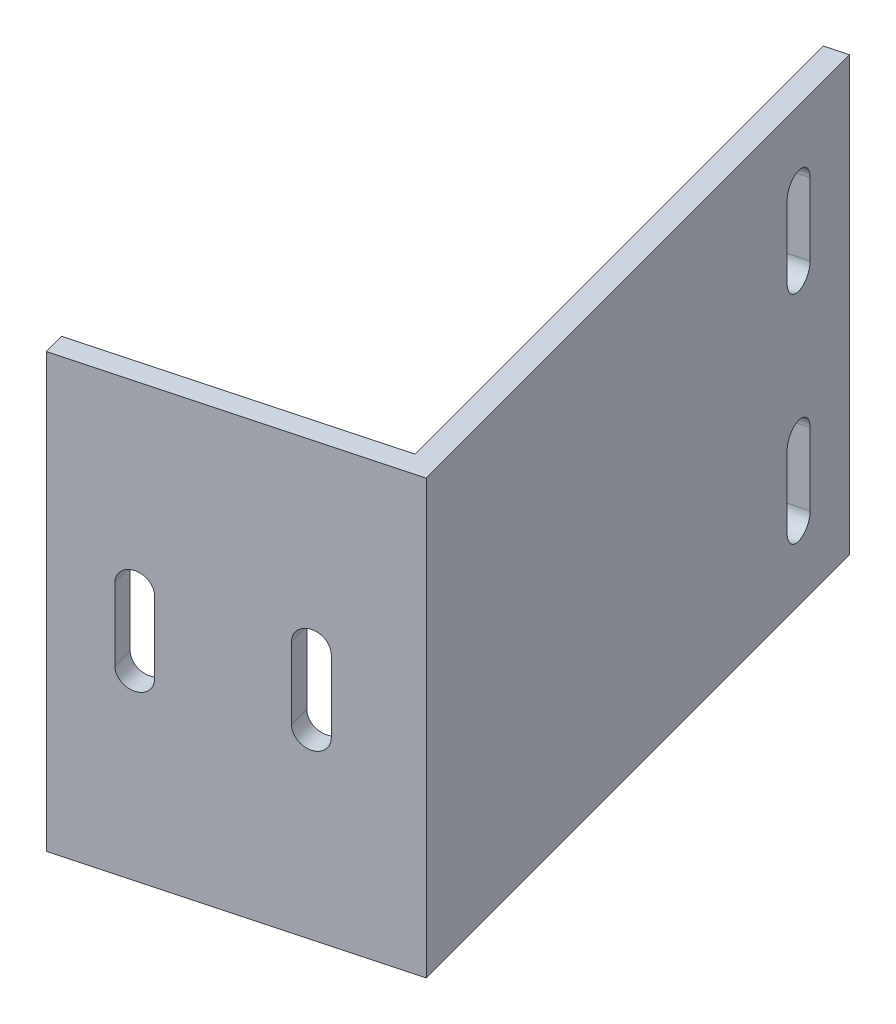
ISO-10303-21;
HEADER;
FILE_DESCRIPTION(('STEP AP214'),'2;1');
FILE_NAME('part.step','',(''),(''),'','','');
FILE_SCHEMA(('AUTOMOTIVE_DESIGN { 1 0 10303 214 1 1 1 1 }'));
ENDSEC;
DATA;
#1=APPLICATION_CONTEXT('core data for automotive mechanical design processes');
#2=APPLICATION_PROTOCOL_DEFINITION('international standard','automotive_design',2000,#1);
#3=PRODUCT_CONTEXT('',#1,'mechanical');
#4=PRODUCT('Part','Part','',(#3));
#5=PRODUCT_RELATED_PRODUCT_CATEGORY('part','',(#4));
#6=PRODUCT_DEFINITION_FORMATION('','',#4);
#7=PRODUCT_DEFINITION_CONTEXT('part definition',#1,'design');
#8=PRODUCT_DEFINITION('design','',#6,#7);
#9=PRODUCT_DEFINITION_SHAPE('','',#8);
#10=(LENGTH_UNIT() NAMED_UNIT(*) SI_UNIT(.MILLI.,.METRE.));
#11=(NAMED_UNIT(*) PLANE_ANGLE_UNIT() SI_UNIT($,.RADIAN.));
#12=(NAMED_UNIT(*) SI_UNIT($,.STERADIAN.) SOLID_ANGLE_UNIT());
#13=UNCERTAINTY_MEASURE_WITH_UNIT(LENGTH_MEASURE(1.E-05),#10,'distance_accuracy_value','');
#14=(GEOMETRIC_REPRESENTATION_CONTEXT(3) GLOBAL_UNCERTAINTY_ASSIGNED_CONTEXT((#13)) GLOBAL_UNIT_ASSIGNED_CONTEXT((#10,
#11,#12)) REPRESENTATION_CONTEXT('',''));
#15=CARTESIAN_POINT('',(0.,0.,0.));
#16=DIRECTION('',(0.,0.,1.));
#17=DIRECTION('',(1.,0.,0.));
#18=AXIS2_PLACEMENT_3D('',#15,#16,#17);
#19=CARTESIAN_POINT('',(903.80760213985,-1784.,2446.096201646));
#20=DIRECTION('',(-0.258819045102985,0.,-0.965925826288944));
#21=DIRECTION('',(-0.965925826288944,0.,0.258819045102985));
#22=AXIS2_PLACEMENT_3D('',#19,#20,#21);
#23=CYLINDRICAL_SURFACE('',#22,4.5);
#24=DIRECTION('',(0.258819045102985,0.,0.965925826288944));
#25=VECTOR('',#24,1.);
#26=CARTESIAN_POINT('',(908.15426835816,-1784.,2444.931515943));
#27=LINE('',#26,#25);
#28=CARTESIAN_POINT('',(908.18015026267,-1784.,2445.028108526));
#29=VERTEX_POINT('',#28);
#30=CARTESIAN_POINT('',(909.73306453328,-1784.,2450.823663484));
#31=VERTEX_POINT('',#30);
#32=EDGE_CURVE('E11',#29,#31,#27,.T.);
#33=ORIENTED_EDGE('',*,*,#32,.T.);
#34=CARTESIAN_POINT('',(905.38639831498,-1784.,2451.988349187));
#35=DIRECTION('',(-0.258819045102985,0.,-0.965925826288944));
#36=DIRECTION('',(-0.965925826288944,0.,0.258819045102985));
#37=AXIS2_PLACEMENT_3D('',#34,#35,#36);
#38=CIRCLE('',#37,4.5);
#39=CARTESIAN_POINT('',(901.03973209668,-1784.,2453.15303489));
#40=VERTEX_POINT('',#39);
#41=EDGE_CURVE('E351',#40,#31,#38,.T.);
#42=ORIENTED_EDGE('',*,*,#41,.F.);
#43=DIRECTION('',(0.258819045102985,0.,0.965925826288944));
#44=VECTOR('',#43,1.);
#45=CARTESIAN_POINT('',(899.46093592155,-1784.,2447.260887349));
#46=LINE('',#45,#44);
#47=CARTESIAN_POINT('',(899.48681782606,-1784.,2447.357479932));
#48=VERTEX_POINT('',#47);
#49=EDGE_CURVE('E406',#48,#40,#46,.T.);
#50=ORIENTED_EDGE('',*,*,#49,.F.);
#51=CARTESIAN_POINT('',(903.83348404436,-1784.,2446.192794229));
#52=DIRECTION('',(-0.258819045102985,0.,-0.965925826288944));
#53=DIRECTION('',(-0.965925826288944,0.,0.258819045102985));
#54=AXIS2_PLACEMENT_3D('',#51,#52,#53);
#55=CIRCLE('',#54,4.5);
#56=EDGE_CURVE('E339',#48,#29,#55,.T.);
#57=ORIENTED_EDGE('',*,*,#56,.T.);
#58=EDGE_LOOP('',(#33,#42,#50,#57));
#59=FACE_BOUND('',#58,.T.);
#60=ADVANCED_FACE('F17',(#59),#23,.F.);
#61=CARTESIAN_POINT('',(908.15426835816,-1784.,2444.931515943));
#62=DIRECTION('',(0.965925826288944,0.,-0.258819045102985));
#63=DIRECTION('',(0.,-1.,0.));
#64=AXIS2_PLACEMENT_3D('',#61,#62,#63);
#65=PLANE('',#64);
#66=DIRECTION('',(0.258819045102985,0.,0.965925826288944));
#67=VECTOR('',#66,1.);
#68=CARTESIAN_POINT('',(908.15426835816,-1804.,2444.931515943));
#69=LINE('',#68,#67);
#70=CARTESIAN_POINT('',(908.18015026267,-1804.,2445.028108526));
#71=VERTEX_POINT('',#70);
#72=CARTESIAN_POINT('',(909.73306453328,-1804.,2450.823663484));
#73=VERTEX_POINT('',#72);
#74=EDGE_CURVE('E25',#71,#73,#69,.T.);
#75=ORIENTED_EDGE('',*,*,#74,.T.);
#76=DIRECTION('',(0.,1.,0.));
#77=VECTOR('',#76,1.);
#78=CARTESIAN_POINT('',(909.73306453328,-1819.,2450.823663484));
#79=LINE('',#78,#77);
#80=EDGE_CURVE('E347',#73,#31,#79,.T.);
#81=ORIENTED_EDGE('',*,*,#80,.T.);
#82=ORIENTED_EDGE('',*,*,#32,.F.);
#83=DIRECTION('',(0.,1.,0.));
#84=VECTOR('',#83,1.);
#85=CARTESIAN_POINT('',(908.18015026267,-1819.,2445.028108526));
#86=LINE('',#85,#84);
#87=EDGE_CURVE('E335',#71,#29,#86,.T.);
#88=ORIENTED_EDGE('',*,*,#87,.F.);
#89=EDGE_LOOP('',(#75,#81,#82,#88));
#90=FACE_BOUND('',#89,.T.);
#91=ADVANCED_FACE('F587',(#90),#65,.F.);
#92=CARTESIAN_POINT('',(903.80760213985,-1804.,2446.096201646));
#93=DIRECTION('',(-0.258819045102985,0.,-0.965925826288944));
#94=DIRECTION('',(0.965925826288944,0.,-0.258819045102985));
#95=AXIS2_PLACEMENT_3D('',#92,#93,#94);
#96=CYLINDRICAL_SURFACE('',#95,4.5);
#97=DIRECTION('',(0.258819045102985,0.,0.965925826288944));
#98=VECTOR('',#97,1.);
#99=CARTESIAN_POINT('',(899.46093592155,-1804.,2447.260887349));
#100=LINE('',#99,#98);
#101=CARTESIAN_POINT('',(899.48681782606,-1804.,2447.357479932));
#102=VERTEX_POINT('',#101);
#103=CARTESIAN_POINT('',(901.03973209668,-1804.,2453.15303489));
#104=VERTEX_POINT('',#103);
#105=EDGE_CURVE('E409',#102,#104,#100,.T.);
#106=ORIENTED_EDGE('',*,*,#105,.T.);
#107=CARTESIAN_POINT('',(905.38639831498,-1804.,2451.988349187));
#108=DIRECTION('',(-0.258819045102985,0.,-0.965925826288944));
#109=DIRECTION('',(0.965925826288944,0.,-0.258819045102985));
#110=AXIS2_PLACEMENT_3D('',#107,#108,#109);
#111=CIRCLE('',#110,4.5);
#112=EDGE_CURVE('E350',#73,#104,#111,.T.);
#113=ORIENTED_EDGE('',*,*,#112,.F.);
#114=ORIENTED_EDGE('',*,*,#74,.F.);
#115=CARTESIAN_POINT('',(903.83348404436,-1804.,2446.192794229));
#116=DIRECTION('',(-0.258819045102985,0.,-0.965925826288944));
#117=DIRECTION('',(0.965925826288944,0.,-0.258819045102985));
#118=AXIS2_PLACEMENT_3D('',#115,#116,#117);
#119=CIRCLE('',#118,4.5);
#120=EDGE_CURVE('E331',#71,#102,#119,.T.);
#121=ORIENTED_EDGE('',*,*,#120,.T.);
#122=EDGE_LOOP('',(#106,#113,#114,#121));
#123=FACE_BOUND('',#122,.T.);
#124=ADVANCED_FACE('F579',(#123),#96,.F.);
#125=CARTESIAN_POINT('',(899.46093592155,-1804.,2447.260887349));
#126=DIRECTION('',(-0.965925826288944,0.,0.258819045102985));
#127=DIRECTION('',(0.,1.,0.));
#128=AXIS2_PLACEMENT_3D('',#125,#126,#127);
#129=PLANE('',#128);
#130=ORIENTED_EDGE('',*,*,#49,.T.);
#131=DIRECTION('',(0.,-1.,0.));
#132=VECTOR('',#131,1.);
#133=CARTESIAN_POINT('',(901.03973209668,-1829.,2453.15303489));
#134=LINE('',#133,#132);
#135=EDGE_CURVE('E372',#40,#104,#134,.T.);
#136=ORIENTED_EDGE('',*,*,#135,.T.);
#137=ORIENTED_EDGE('',*,*,#105,.F.);
#138=DIRECTION('',(0.,-1.,0.));
#139=VECTOR('',#138,1.);
#140=CARTESIAN_POINT('',(899.48681782606,-1829.,2447.357479932));
#141=LINE('',#140,#139);
#142=EDGE_CURVE('E342',#48,#102,#141,.T.);
#143=ORIENTED_EDGE('',*,*,#142,.F.);
#144=EDGE_LOOP('',(#130,#136,#137,#143));
#145=FACE_BOUND('',#144,.T.);
#146=ADVANCED_FACE('F571',(#145),#129,.F.);
#147=CARTESIAN_POINT('',(946.79130140972,-1784.,2434.578754139));
#148=DIRECTION('',(0.965925826288944,0.,-0.258819045102985));
#149=DIRECTION('',(0.,-1.,0.));
#150=AXIS2_PLACEMENT_3D('',#147,#148,#149);
#151=PLANE('',#150);
#152=DIRECTION('',(0.258819045102985,0.,0.965925826288944));
#153=VECTOR('',#152,1.);
#154=CARTESIAN_POINT('',(946.79130140972,-1804.,2434.578754139));
#155=LINE('',#154,#153);
#156=CARTESIAN_POINT('',(946.81718331423,-1804.,2434.675346722));
#157=VERTEX_POINT('',#156);
#158=CARTESIAN_POINT('',(948.37009758484,-1804.,2440.47090168));
#159=VERTEX_POINT('',#158);
#160=EDGE_CURVE('E403',#157,#159,#155,.T.);
#161=ORIENTED_EDGE('',*,*,#160,.T.);
#162=DIRECTION('',(0.,1.,0.));
#163=VECTOR('',#162,1.);
#164=CARTESIAN_POINT('',(948.37009758484,-1819.,2440.47090168));
#165=LINE('',#164,#163);
#166=CARTESIAN_POINT('',(948.37009758484,-1784.,2440.47090168));
#167=VERTEX_POINT('',#166);
#168=EDGE_CURVE('E310',#159,#167,#165,.T.);
#169=ORIENTED_EDGE('',*,*,#168,.T.);
#170=DIRECTION('',(0.258819045102985,0.,0.965925826288944));
#171=VECTOR('',#170,1.);
#172=CARTESIAN_POINT('',(946.79130140972,-1784.,2434.578754139));
#173=LINE('',#172,#171);
#174=CARTESIAN_POINT('',(946.81718331423,-1784.,2434.675346722));
#175=VERTEX_POINT('',#174);
#176=EDGE_CURVE('E400',#175,#167,#173,.T.);
#177=ORIENTED_EDGE('',*,*,#176,.F.);
#178=DIRECTION('',(0.,1.,0.));
#179=VECTOR('',#178,1.);
#180=CARTESIAN_POINT('',(946.81718331423,-1819.,2434.675346722));
#181=LINE('',#180,#179);
#182=EDGE_CURVE('E319',#157,#175,#181,.T.);
#183=ORIENTED_EDGE('',*,*,#182,.F.);
#184=EDGE_LOOP('',(#161,#169,#177,#183));
#185=FACE_BOUND('',#184,.T.);
#186=ADVANCED_FACE('F563',(#185),#151,.F.);
#187=CARTESIAN_POINT('',(942.44463519142,-1804.,2435.743439842));
#188=DIRECTION('',(-0.258819045102985,0.,-0.965925826288944));
#189=DIRECTION('',(0.965925826288944,0.,-0.258819045102985));
#190=AXIS2_PLACEMENT_3D('',#187,#188,#189);
#191=CYLINDRICAL_SURFACE('',#190,4.5);
#192=DIRECTION('',(0.258819045102985,0.,0.965925826288944));
#193=VECTOR('',#192,1.);
#194=CARTESIAN_POINT('',(938.09796897312,-1804.,2436.908125545));
#195=LINE('',#194,#193);
#196=CARTESIAN_POINT('',(938.12385087763,-1804.,2437.004718128));
#197=VERTEX_POINT('',#196);
#198=CARTESIAN_POINT('',(939.67676514824,-1804.,2442.800273086));
#199=VERTEX_POINT('',#198);
#200=EDGE_CURVE('E397',#197,#199,#195,.T.);
#201=ORIENTED_EDGE('',*,*,#200,.T.);
#202=CARTESIAN_POINT('',(944.02343136654,-1804.,2441.635587383));
#203=DIRECTION('',(-0.258819045102985,0.,-0.965925826288944));
#204=DIRECTION('',(0.965925826288944,0.,-0.258819045102985));
#205=AXIS2_PLACEMENT_3D('',#202,#203,#204);
#206=CIRCLE('',#205,4.5);
#207=EDGE_CURVE('E314',#159,#199,#206,.T.);
#208=ORIENTED_EDGE('',*,*,#207,.F.);
#209=ORIENTED_EDGE('',*,*,#160,.F.);
#210=CARTESIAN_POINT('',(942.47051709593,-1804.,2435.840032425));
#211=DIRECTION('',(-0.258819045102985,0.,-0.965925826288944));
#212=DIRECTION('',(0.965925826288944,0.,-0.258819045102985));
#213=AXIS2_PLACEMENT_3D('',#210,#211,#212);
#214=CIRCLE('',#213,4.5);
#215=EDGE_CURVE('E309',#157,#197,#214,.T.);
#216=ORIENTED_EDGE('',*,*,#215,.T.);
#217=EDGE_LOOP('',(#201,#208,#209,#216));
#218=FACE_BOUND('',#217,.T.);
#219=ADVANCED_FACE('F555',(#218),#191,.F.);
#220=CARTESIAN_POINT('',(942.44463519142,-1784.,2435.743439842));
#221=DIRECTION('',(-0.258819045102985,0.,-0.965925826288944));
#222=DIRECTION('',(-0.965925826288944,0.,0.258819045102985));
#223=AXIS2_PLACEMENT_3D('',#220,#221,#222);
#224=CYLINDRICAL_SURFACE('',#223,4.5);
#225=ORIENTED_EDGE('',*,*,#176,.T.);
#226=CARTESIAN_POINT('',(944.02343136654,-1784.,2441.635587383));
#227=DIRECTION('',(-0.258819045102985,0.,-0.965925826288944));
#228=DIRECTION('',(-0.965925826288944,0.,0.258819045102985));
#229=AXIS2_PLACEMENT_3D('',#226,#227,#228);
#230=CIRCLE('',#229,4.5);
#231=CARTESIAN_POINT('',(939.67676514824,-1784.,2442.800273086));
#232=VERTEX_POINT('',#231);
#233=EDGE_CURVE('E315',#232,#167,#230,.T.);
#234=ORIENTED_EDGE('',*,*,#233,.F.);
#235=DIRECTION('',(0.258819045102985,0.,0.965925826288944));
#236=VECTOR('',#235,1.);
#237=CARTESIAN_POINT('',(938.09796897312,-1784.,2436.908125545));
#238=LINE('',#237,#236);
#239=CARTESIAN_POINT('',(938.12385087763,-1784.,2437.004718128));
#240=VERTEX_POINT('',#239);
#241=EDGE_CURVE('E394',#240,#232,#238,.T.);
#242=ORIENTED_EDGE('',*,*,#241,.F.);
#243=CARTESIAN_POINT('',(942.47051709593,-1784.,2435.840032425));
#244=DIRECTION('',(-0.258819045102985,0.,-0.965925826288944));
#245=DIRECTION('',(-0.965925826288944,0.,0.258819045102985));
#246=AXIS2_PLACEMENT_3D('',#243,#244,#245);
#247=CIRCLE('',#246,4.5);
#248=EDGE_CURVE('E323',#240,#175,#247,.T.);
#249=ORIENTED_EDGE('',*,*,#248,.T.);
#250=EDGE_LOOP('',(#225,#234,#242,#249));
#251=FACE_BOUND('',#250,.T.);
#252=ADVANCED_FACE('F547',(#251),#224,.F.);
#253=CARTESIAN_POINT('',(938.09796897312,-1804.,2436.908125545));
#254=DIRECTION('',(-0.965925826288944,0.,0.258819045102985));
#255=DIRECTION('',(0.,1.,0.));
#256=AXIS2_PLACEMENT_3D('',#253,#254,#255);
#257=PLANE('',#256);
#258=ORIENTED_EDGE('',*,*,#241,.T.);
#259=DIRECTION('',(0.,-1.,0.));
#260=VECTOR('',#259,1.);
#261=CARTESIAN_POINT('',(939.67676514824,-1829.,2442.800273086));
#262=LINE('',#261,#260);
#263=EDGE_CURVE('E362',#232,#199,#262,.T.);
#264=ORIENTED_EDGE('',*,*,#263,.T.);
#265=ORIENTED_EDGE('',*,*,#200,.F.);
#266=DIRECTION('',(0.,-1.,0.));
#267=VECTOR('',#266,1.);
#268=CARTESIAN_POINT('',(938.12385087763,-1829.,2437.004718128));
#269=LINE('',#268,#267);
#270=EDGE_CURVE('E327',#240,#197,#269,.T.);
#271=ORIENTED_EDGE('',*,*,#270,.F.);
#272=EDGE_LOOP('',(#258,#264,#265,#271));
#273=FACE_BOUND('',#272,.T.);
#274=ADVANCED_FACE('F504',(#273),#257,.F.);
#275=CARTESIAN_POINT('',(931.44651484772,-1754.,2293.855239667));
#276=DIRECTION('',(0.965925826288944,0.,-0.258819045102985));
#277=DIRECTION('',(-0.258819045102985,0.,-0.965925826288944));
#278=AXIS2_PLACEMENT_3D('',#275,#276,#277);
#279=CYLINDRICAL_SURFACE('',#278,4.5);
#280=DIRECTION('',(-0.965925826288944,0.,0.258819045102985));
#281=VECTOR('',#280,1.);
#282=CARTESIAN_POINT('',(932.61120055068,-1754.,2298.201905886));
#283=LINE('',#282,#281);
#284=CARTESIAN_POINT('',(932.51460796805,-1754.,2298.22778779));
#285=VERTEX_POINT('',#284);
#286=CARTESIAN_POINT('',(926.71905301032,-1754.,2299.780702061));
#287=VERTEX_POINT('',#286);
#288=EDGE_CURVE('E225',#285,#287,#283,.T.);
#289=ORIENTED_EDGE('',*,*,#288,.T.);
#290=CARTESIAN_POINT('',(925.55436730736,-1754.,2295.434035842));
#291=DIRECTION('',(0.965925826288944,0.,-0.258819045102985));
#292=DIRECTION('',(-0.258819045102985,0.,-0.965925826288944));
#293=AXIS2_PLACEMENT_3D('',#290,#291,#292);
#294=CIRCLE('',#293,4.5);
#295=CARTESIAN_POINT('',(924.38968160439,-1754.,2291.087369624));
#296=VERTEX_POINT('',#295);
#297=EDGE_CURVE('E291',#296,#287,#294,.T.);
#298=ORIENTED_EDGE('',*,*,#297,.F.);
#299=DIRECTION('',(-0.965925826288944,0.,0.258819045102985));
#300=VECTOR('',#299,1.);
#301=CARTESIAN_POINT('',(930.28182914476,-1754.,2289.508573449));
#302=LINE('',#301,#300);
#303=CARTESIAN_POINT('',(930.18523656213,-1754.,2289.534455353));
#304=VERTEX_POINT('',#303);
#305=EDGE_CURVE('E387',#304,#296,#302,.T.);
#306=ORIENTED_EDGE('',*,*,#305,.F.);
#307=CARTESIAN_POINT('',(931.34992226509,-1754.,2293.881121572));
#308=DIRECTION('',(0.965925826288944,0.,-0.258819045102985));
#309=DIRECTION('',(-0.258819045102985,0.,-0.965925826288944));
#310=AXIS2_PLACEMENT_3D('',#307,#308,#309);
#311=CIRCLE('',#310,4.5);
#312=EDGE_CURVE('E235',#304,#285,#311,.T.);
#313=ORIENTED_EDGE('',*,*,#312,.T.);
#314=EDGE_LOOP('',(#289,#298,#306,#313));
#315=FACE_BOUND('',#314,.T.);
#316=ADVANCED_FACE('F500',(#315),#279,.F.);
#317=CARTESIAN_POINT('',(932.61120055068,-1754.,2298.201905886));
#318=DIRECTION('',(0.258819045102985,0.,0.965925826288944));
#319=DIRECTION('',(0.,-1.,0.));
#320=AXIS2_PLACEMENT_3D('',#317,#318,#319);
#321=PLANE('',#320);
#322=DIRECTION('',(-0.965925826288944,0.,0.258819045102985));
#323=VECTOR('',#322,1.);
#324=CARTESIAN_POINT('',(932.61120055068,-1774.,2298.201905886));
#325=LINE('',#324,#323);
#326=CARTESIAN_POINT('',(932.51460796805,-1774.,2298.22778779));
#327=VERTEX_POINT('',#326);
#328=CARTESIAN_POINT('',(926.71905301032,-1774.,2299.780702061));
#329=VERTEX_POINT('',#328);
#330=EDGE_CURVE('E214',#327,#329,#325,.T.);
#331=ORIENTED_EDGE('',*,*,#330,.T.);
#332=DIRECTION('',(0.,1.,0.));
#333=VECTOR('',#332,1.);
#334=CARTESIAN_POINT('',(926.71905301032,-1804.,2299.780702061));
#335=LINE('',#334,#333);
#336=EDGE_CURVE('E277',#329,#287,#335,.T.);
#337=ORIENTED_EDGE('',*,*,#336,.T.);
#338=ORIENTED_EDGE('',*,*,#288,.F.);
#339=DIRECTION('',(0.,1.,0.));
#340=VECTOR('',#339,1.);
#341=CARTESIAN_POINT('',(932.51460796805,-1804.,2298.22778779));
#342=LINE('',#341,#340);
#343=EDGE_CURVE('E229',#327,#285,#342,.T.);
#344=ORIENTED_EDGE('',*,*,#343,.F.);
#345=EDGE_LOOP('',(#331,#337,#338,#344));
#346=FACE_BOUND('',#345,.T.);
#347=ADVANCED_FACE('F230',(#346),#321,.F.);
#348=CARTESIAN_POINT('',(931.44651484772,-1774.,2293.855239667));
#349=DIRECTION('',(0.965925826288944,0.,-0.258819045102985));
#350=DIRECTION('',(0.258819045102985,0.,0.965925826288944));
#351=AXIS2_PLACEMENT_3D('',#348,#349,#350);
#352=CYLINDRICAL_SURFACE('',#351,4.5);
#353=DIRECTION('',(-0.965925826288944,0.,0.258819045102985));
#354=VECTOR('',#353,1.);
#355=CARTESIAN_POINT('',(930.28182914476,-1774.,2289.508573449));
#356=LINE('',#355,#354);
#357=CARTESIAN_POINT('',(930.18523656213,-1774.,2289.534455353));
#358=VERTEX_POINT('',#357);
#359=CARTESIAN_POINT('',(924.38968160439,-1774.,2291.087369624));
#360=VERTEX_POINT('',#359);
#361=EDGE_CURVE('E226',#358,#360,#356,.T.);
#362=ORIENTED_EDGE('',*,*,#361,.T.);
#363=CARTESIAN_POINT('',(925.55436730736,-1774.,2295.434035842));
#364=DIRECTION('',(0.965925826288944,0.,-0.258819045102985));
#365=DIRECTION('',(0.258819045102985,0.,0.965925826288944));
#366=AXIS2_PLACEMENT_3D('',#363,#364,#365);
#367=CIRCLE('',#366,4.5);
#368=EDGE_CURVE('E220',#329,#360,#367,.T.);
#369=ORIENTED_EDGE('',*,*,#368,.F.);
#370=ORIENTED_EDGE('',*,*,#330,.F.);
#371=CARTESIAN_POINT('',(931.34992226509,-1774.,2293.881121572));
#372=DIRECTION('',(0.965925826288944,0.,-0.258819045102985));
#373=DIRECTION('',(0.258819045102985,0.,0.965925826288944));
#374=AXIS2_PLACEMENT_3D('',#371,#372,#373);
#375=CIRCLE('',#374,4.5);
#376=EDGE_CURVE('E218',#327,#358,#375,.T.);
#377=ORIENTED_EDGE('',*,*,#376,.T.);
#378=EDGE_LOOP('',(#362,#369,#370,#377));
#379=FACE_BOUND('',#378,.T.);
#380=ADVANCED_FACE('F216',(#379),#352,.F.);
#381=CARTESIAN_POINT('',(930.28182914476,-1774.,2289.508573449));
#382=DIRECTION('',(-0.258819045102985,0.,-0.965925826288944));
#383=DIRECTION('',(-0.965925826288944,0.,0.258819045102985));
#384=AXIS2_PLACEMENT_3D('',#381,#382,#383);
#385=PLANE('',#384);
#386=ORIENTED_EDGE('',*,*,#305,.T.);
#387=DIRECTION('',(0.,-1.,0.));
#388=VECTOR('',#387,1.);
#389=CARTESIAN_POINT('',(924.38968160439,-1814.,2291.087369624));
#390=LINE('',#389,#388);
#391=EDGE_CURVE('E287',#296,#360,#390,.T.);
#392=ORIENTED_EDGE('',*,*,#391,.T.);
#393=ORIENTED_EDGE('',*,*,#361,.F.);
#394=DIRECTION('',(0.,-1.,0.));
#395=VECTOR('',#394,1.);
#396=CARTESIAN_POINT('',(930.18523656213,-1814.,2289.534455353));
#397=LINE('',#396,#395);
#398=EDGE_CURVE('E241',#304,#358,#397,.T.);
#399=ORIENTED_EDGE('',*,*,#398,.F.);
#400=EDGE_LOOP('',(#386,#392,#393,#399));
#401=FACE_BOUND('',#400,.T.);
#402=ADVANCED_FACE('F444',(#401),#385,.F.);
#403=CARTESIAN_POINT('',(932.61120055068,-1814.,2298.201905886));
#404=DIRECTION('',(0.258819045102985,0.,0.965925826288944));
#405=DIRECTION('',(0.,-1.,0.));
#406=AXIS2_PLACEMENT_3D('',#403,#404,#405);
#407=PLANE('',#406);
#408=DIRECTION('',(-0.965925826288944,0.,0.258819045102985));
#409=VECTOR('',#408,1.);
#410=CARTESIAN_POINT('',(932.61120055068,-1834.,2298.201905886));
#411=LINE('',#410,#409);
#412=CARTESIAN_POINT('',(932.51460796805,-1834.,2298.22778779));
#413=VERTEX_POINT('',#412);
#414=CARTESIAN_POINT('',(926.71905301032,-1834.,2299.780702061));
#415=VERTEX_POINT('',#414);
#416=EDGE_CURVE('E384',#413,#415,#411,.T.);
#417=ORIENTED_EDGE('',*,*,#416,.T.);
#418=DIRECTION('',(0.,1.,0.));
#419=VECTOR('',#418,1.);
#420=CARTESIAN_POINT('',(926.71905301032,-1834.,2299.780702061));
#421=LINE('',#420,#419);
#422=CARTESIAN_POINT('',(926.71905301032,-1814.,2299.780702061));
#423=VERTEX_POINT('',#422);
#424=EDGE_CURVE('E263',#415,#423,#421,.T.);
#425=ORIENTED_EDGE('',*,*,#424,.T.);
#426=DIRECTION('',(-0.965925826288944,0.,0.258819045102985));
#427=VECTOR('',#426,1.);
#428=CARTESIAN_POINT('',(932.61120055068,-1814.,2298.201905886));
#429=LINE('',#428,#427);
#430=CARTESIAN_POINT('',(932.51460796805,-1814.,2298.22778779));
#431=VERTEX_POINT('',#430);
#432=EDGE_CURVE('E298',#431,#423,#429,.T.);
#433=ORIENTED_EDGE('',*,*,#432,.F.);
#434=DIRECTION('',(0.,1.,0.));
#435=VECTOR('',#434,1.);
#436=CARTESIAN_POINT('',(932.51460796805,-1834.,2298.22778779));
#437=LINE('',#436,#435);
#438=EDGE_CURVE('E687',#413,#431,#437,.T.);
#439=ORIENTED_EDGE('',*,*,#438,.F.);
#440=EDGE_LOOP('',(#417,#425,#433,#439));
#441=FACE_BOUND('',#440,.T.);
#442=ADVANCED_FACE('F424',(#441),#407,.F.);
#443=CARTESIAN_POINT('',(931.44651484772,-1834.,2293.855239667));
#444=DIRECTION('',(0.965925826288944,0.,-0.258819045102985));
#445=DIRECTION('',(0.258819045102985,0.,0.965925826288944));
#446=AXIS2_PLACEMENT_3D('',#443,#444,#445);
#447=CYLINDRICAL_SURFACE('',#446,4.5);
#448=DIRECTION('',(-0.965925826288944,0.,0.258819045102985));
#449=VECTOR('',#448,1.);
#450=CARTESIAN_POINT('',(930.28182914476,-1834.,2289.508573449));
#451=LINE('',#450,#449);
#452=CARTESIAN_POINT('',(930.18523656213,-1834.,2289.534455353));
#453=VERTEX_POINT('',#452);
#454=CARTESIAN_POINT('',(924.38968160439,-1834.,2291.087369624));
#455=VERTEX_POINT('',#454);
#456=EDGE_CURVE('E295',#453,#455,#451,.T.);
#457=ORIENTED_EDGE('',*,*,#456,.T.);
#458=CARTESIAN_POINT('',(925.55436730736,-1834.,2295.434035842));
#459=DIRECTION('',(0.965925826288944,0.,-0.258819045102985));
#460=DIRECTION('',(0.258819045102985,0.,0.965925826288944));
#461=AXIS2_PLACEMENT_3D('',#458,#459,#460);
#462=CIRCLE('',#461,4.5);
#463=EDGE_CURVE('E267',#415,#455,#462,.T.);
#464=ORIENTED_EDGE('',*,*,#463,.F.);
#465=ORIENTED_EDGE('',*,*,#416,.F.);
#466=CARTESIAN_POINT('',(931.34992226509,-1834.,2293.881121572));
#467=DIRECTION('',(0.965925826288944,0.,-0.258819045102985));
#468=DIRECTION('',(0.258819045102985,0.,0.965925826288944));
#469=AXIS2_PLACEMENT_3D('',#466,#467,#468);
#470=CIRCLE('',#469,4.5);
#471=EDGE_CURVE('E691',#413,#453,#470,.T.);
#472=ORIENTED_EDGE('',*,*,#471,.T.);
#473=EDGE_LOOP('',(#457,#464,#465,#472));
#474=FACE_BOUND('',#473,.T.);
#475=ADVANCED_FACE('F418',(#474),#447,.F.);
#476=CARTESIAN_POINT('',(931.44651484772,-1814.,2293.855239667));
#477=DIRECTION('',(0.965925826288944,0.,-0.258819045102985));
#478=DIRECTION('',(-0.258819045102985,0.,-0.965925826288944));
#479=AXIS2_PLACEMENT_3D('',#476,#477,#478);
#480=CYLINDRICAL_SURFACE('',#479,4.5);
#481=ORIENTED_EDGE('',*,*,#432,.T.);
#482=CARTESIAN_POINT('',(925.55436730736,-1814.,2295.434035842));
#483=DIRECTION('',(0.965925826288944,0.,-0.258819045102985));
#484=DIRECTION('',(-0.258819045102985,0.,-0.965925826288944));
#485=AXIS2_PLACEMENT_3D('',#482,#483,#484);
#486=CIRCLE('',#485,4.5);
#487=CARTESIAN_POINT('',(924.38968160439,-1814.,2291.087369624));
#488=VERTEX_POINT('',#487);
#489=EDGE_CURVE('E268',#488,#423,#486,.T.);
#490=ORIENTED_EDGE('',*,*,#489,.F.);
#491=DIRECTION('',(-0.965925826288944,0.,0.258819045102985));
#492=VECTOR('',#491,1.);
#493=CARTESIAN_POINT('',(930.28182914476,-1814.,2289.508573449));
#494=LINE('',#493,#492);
#495=CARTESIAN_POINT('',(930.18523656213,-1814.,2289.534455353));
#496=VERTEX_POINT('',#495);
#497=EDGE_CURVE('E299',#496,#488,#494,.T.);
#498=ORIENTED_EDGE('',*,*,#497,.F.);
#499=CARTESIAN_POINT('',(931.34992226509,-1814.,2293.881121572));
#500=DIRECTION('',(0.965925826288944,0.,-0.258819045102985));
#501=DIRECTION('',(-0.258819045102985,0.,-0.965925826288944));
#502=AXIS2_PLACEMENT_3D('',#499,#500,#501);
#503=CIRCLE('',#502,4.5);
#504=EDGE_CURVE('E249',#496,#431,#503,.T.);
#505=ORIENTED_EDGE('',*,*,#504,.T.);
#506=EDGE_LOOP('',(#481,#490,#498,#505));
#507=FACE_BOUND('',#506,.T.);
#508=ADVANCED_FACE('F423',(#507),#480,.F.);
#509=CARTESIAN_POINT('',(930.28182914476,-1834.,2289.508573449));
#510=DIRECTION('',(-0.258819045102985,0.,-0.965925826288944));
#511=DIRECTION('',(-0.965925826288944,0.,0.258819045102985));
#512=AXIS2_PLACEMENT_3D('',#509,#510,#511);
#513=PLANE('',#512);
#514=ORIENTED_EDGE('',*,*,#497,.T.);
#515=DIRECTION('',(0.,-1.,0.));
#516=VECTOR('',#515,1.);
#517=CARTESIAN_POINT('',(924.38968160439,-1844.,2291.087369624));
#518=LINE('',#517,#516);
#519=EDGE_CURVE('E273',#488,#455,#518,.T.);
#520=ORIENTED_EDGE('',*,*,#519,.T.);
#521=ORIENTED_EDGE('',*,*,#456,.F.);
#522=DIRECTION('',(0.,-1.,0.));
#523=VECTOR('',#522,1.);
#524=CARTESIAN_POINT('',(930.18523656213,-1844.,2289.534455353));
#525=LINE('',#524,#523);
#526=EDGE_CURVE('E243',#496,#453,#525,.T.);
#527=ORIENTED_EDGE('',*,*,#526,.F.);
#528=EDGE_LOOP('',(#514,#520,#521,#527));
#529=FACE_BOUND('',#528,.T.);
#530=ADVANCED_FACE('F512',(#529),#513,.F.);
#531=CARTESIAN_POINT('',(926.17354136304,-1734.,2274.562605046));
#532=DIRECTION('',(0.,1.,0.));
#533=DIRECTION('',(1.,0.,0.));
#534=AXIS2_PLACEMENT_3D('',#531,#532,#533);
#535=PLANE('',#534);
#536=DIRECTION('',(0.258819045102985,0.,0.965925826288944));
#537=VECTOR('',#536,1.);
#538=CARTESIAN_POINT('',(926.17354136304,-1734.,2274.562605046));
#539=LINE('',#538,#537);
#540=CARTESIAN_POINT('',(926.17354136304,-1734.,2274.562605046));
#541=VERTEX_POINT('',#540);
#542=CARTESIAN_POINT('',(969.13750285006,-1734.,2434.90629221));
#543=VERTEX_POINT('',#542);
#544=EDGE_CURVE('E709',#541,#543,#539,.T.);
#545=ORIENTED_EDGE('',*,*,#544,.F.);
#546=DIRECTION('',(-0.965925826288944,0.,0.258819045102985));
#547=VECTOR('',#546,1.);
#548=CARTESIAN_POINT('',(926.17354136304,-1734.,2274.562605046));
#549=LINE('',#548,#547);
#550=CARTESIAN_POINT('',(920.37798640531,-1734.,2276.115519317));
#551=VERTEX_POINT('',#550);
#552=EDGE_CURVE('E258',#541,#551,#549,.T.);
#553=ORIENTED_EDGE('',*,*,#552,.T.);
#554=DIRECTION('',(0.258819045102985,0.,0.965925826288944));
#555=VECTOR('',#554,1.);
#556=CARTESIAN_POINT('',(920.37798640531,-1734.,2276.115519317));
#557=LINE('',#556,#555);
#558=CARTESIAN_POINT('',(961.78903362171,-1734.,2430.663651523));
#559=VERTEX_POINT('',#558);
#560=EDGE_CURVE('E262',#551,#559,#557,.T.);
#561=ORIENTED_EDGE('',*,*,#560,.T.);
#562=DIRECTION('',(-0.965925826288944,0.,0.258819045102985));
#563=VECTOR('',#562,1.);
#564=CARTESIAN_POINT('',(967.58458857944,-1734.,2429.110737252));
#565=LINE('',#564,#563);
#566=CARTESIAN_POINT('',(884.51496751858,-1734.,2451.369175131));
#567=VERTEX_POINT('',#566);
#568=EDGE_CURVE('E305',#559,#567,#565,.T.);
#569=ORIENTED_EDGE('',*,*,#568,.T.);
#570=DIRECTION('',(0.258819045102985,0.,0.965925826288944));
#571=VECTOR('',#570,1.);
#572=CARTESIAN_POINT('',(884.51496751858,-1734.,2451.369175131));
#573=LINE('',#572,#571);
#574=CARTESIAN_POINT('',(886.0678817892,-1734.,2457.164730089));
#575=VERTEX_POINT('',#574);
#576=EDGE_CURVE('E355',#567,#575,#573,.T.);
#577=ORIENTED_EDGE('',*,*,#576,.T.);
#578=DIRECTION('',(0.965925826288944,0.,-0.258819045102985));
#579=VECTOR('',#578,1.);
#580=CARTESIAN_POINT('',(886.0678817892,-1734.,2457.164730089));
#581=LINE('',#580,#579);
#582=EDGE_CURVE('E359',#575,#543,#581,.T.);
#583=ORIENTED_EDGE('',*,*,#582,.T.);
#584=EDGE_LOOP('',(#545,#553,#561,#569,#577,#583));
#585=FACE_BOUND('',#584,.T.);
#586=ADVANCED_FACE('F495',(#585),#535,.T.);
#587=CARTESIAN_POINT('',(969.13750285006,-1854.,2434.90629221));
#588=DIRECTION('',(0.258819045102985,0.,0.965925826288944));
#589=DIRECTION('',(0.,-1.,0.));
#590=AXIS2_PLACEMENT_3D('',#587,#588,#589);
#591=PLANE('',#590);
#592=ORIENTED_EDGE('',*,*,#135,.F.);
#593=ORIENTED_EDGE('',*,*,#41,.T.);
#594=ORIENTED_EDGE('',*,*,#80,.F.);
#595=ORIENTED_EDGE('',*,*,#112,.T.);
#596=EDGE_LOOP('',(#592,#593,#594,#595));
#597=FACE_BOUND('',#596,.T.);
#598=ORIENTED_EDGE('',*,*,#263,.F.);
#599=ORIENTED_EDGE('',*,*,#233,.T.);
#600=ORIENTED_EDGE('',*,*,#168,.F.);
#601=ORIENTED_EDGE('',*,*,#207,.T.);
#602=EDGE_LOOP('',(#598,#599,#600,#601));
#603=FACE_BOUND('',#602,.T.);
#604=DIRECTION('',(-0.965925826288944,0.,0.258819045102985));
#605=VECTOR('',#604,1.);
#606=CARTESIAN_POINT('',(969.13750285006,-1854.,2434.90629221));
#607=LINE('',#606,#605);
#608=CARTESIAN_POINT('',(969.13750285006,-1854.,2434.90629221));
#609=VERTEX_POINT('',#608);
#610=CARTESIAN_POINT('',(886.0678817892,-1854.,2457.164730089));
#611=VERTEX_POINT('',#610);
#612=EDGE_CURVE('E675',#609,#611,#607,.T.);
#613=ORIENTED_EDGE('',*,*,#612,.F.);
#614=DIRECTION('',(0.,1.,0.));
#615=VECTOR('',#614,1.);
#616=CARTESIAN_POINT('',(969.13750285006,-1854.,2434.90629221));
#617=LINE('',#616,#615);
#618=EDGE_CURVE('E705',#609,#543,#617,.T.);
#619=ORIENTED_EDGE('',*,*,#618,.T.);
#620=ORIENTED_EDGE('',*,*,#582,.F.);
#621=DIRECTION('',(0.,1.,0.));
#622=VECTOR('',#621,1.);
#623=CARTESIAN_POINT('',(886.0678817892,-1854.,2457.164730089));
#624=LINE('',#623,#622);
#625=EDGE_CURVE('E346',#611,#575,#624,.T.);
#626=ORIENTED_EDGE('',*,*,#625,.F.);
#627=EDGE_LOOP('',(#613,#619,#620,#626));
#628=FACE_BOUND('',#627,.T.);
#629=ADVANCED_FACE('F488',(#597,#603,#628),#591,.T.);
#630=CARTESIAN_POINT('',(884.51496751858,-1854.,2451.369175131));
#631=DIRECTION('',(-0.965925826288944,0.,0.258819045102985));
#632=DIRECTION('',(0.,1.,0.));
#633=AXIS2_PLACEMENT_3D('',#630,#631,#632);
#634=PLANE('',#633);
#635=DIRECTION('',(0.,1.,0.));
#636=VECTOR('',#635,1.);
#637=CARTESIAN_POINT('',(884.51496751858,-1854.,2451.369175131));
#638=LINE('',#637,#636);
#639=CARTESIAN_POINT('',(884.51496751858,-1854.,2451.369175131));
#640=VERTEX_POINT('',#639);
#641=EDGE_CURVE('E276',#640,#567,#638,.T.);
#642=ORIENTED_EDGE('',*,*,#641,.F.);
#643=DIRECTION('',(0.258819045102985,0.,0.965925826288944));
#644=VECTOR('',#643,1.);
#645=CARTESIAN_POINT('',(884.51496751858,-1854.,2451.369175131));
#646=LINE('',#645,#644);
#647=EDGE_CURVE('E665',#640,#611,#646,.T.);
#648=ORIENTED_EDGE('',*,*,#647,.T.);
#649=ORIENTED_EDGE('',*,*,#625,.T.);
#650=ORIENTED_EDGE('',*,*,#576,.F.);
#651=EDGE_LOOP('',(#642,#648,#649,#650));
#652=FACE_BOUND('',#651,.T.);
#653=ADVANCED_FACE('F473',(#652),#634,.T.);
#654=CARTESIAN_POINT('',(967.58458857944,-1854.,2429.110737252));
#655=DIRECTION('',(0.258819045102985,0.,0.965925826288944));
#656=DIRECTION('',(0.,-1.,0.));
#657=AXIS2_PLACEMENT_3D('',#654,#655,#656);
#658=PLANE('',#657);
#659=ORIENTED_EDGE('',*,*,#120,.F.);
#660=ORIENTED_EDGE('',*,*,#87,.T.);
#661=ORIENTED_EDGE('',*,*,#56,.F.);
#662=ORIENTED_EDGE('',*,*,#142,.T.);
#663=EDGE_LOOP('',(#659,#660,#661,#662));
#664=FACE_BOUND('',#663,.T.);
#665=ORIENTED_EDGE('',*,*,#215,.F.);
#666=ORIENTED_EDGE('',*,*,#182,.T.);
#667=ORIENTED_EDGE('',*,*,#248,.F.);
#668=ORIENTED_EDGE('',*,*,#270,.T.);
#669=EDGE_LOOP('',(#665,#666,#667,#668));
#670=FACE_BOUND('',#669,.T.);
#671=ORIENTED_EDGE('',*,*,#641,.T.);
#672=ORIENTED_EDGE('',*,*,#568,.F.);
#673=DIRECTION('',(0.,1.,0.));
#674=VECTOR('',#673,1.);
#675=CARTESIAN_POINT('',(961.78903362171,-1854.,2430.663651523));
#676=LINE('',#675,#674);
#677=CARTESIAN_POINT('',(961.78903362171,-1854.,2430.663651523));
#678=VERTEX_POINT('',#677);
#679=EDGE_CURVE('E269',#678,#559,#676,.T.);
#680=ORIENTED_EDGE('',*,*,#679,.F.);
#681=DIRECTION('',(-0.965925826288944,0.,0.258819045102985));
#682=VECTOR('',#681,1.);
#683=CARTESIAN_POINT('',(967.58458857944,-1854.,2429.110737252));
#684=LINE('',#683,#682);
#685=EDGE_CURVE('E662',#678,#640,#684,.T.);
#686=ORIENTED_EDGE('',*,*,#685,.T.);
#687=EDGE_LOOP('',(#671,#672,#680,#686));
#688=FACE_BOUND('',#687,.T.);
#689=ADVANCED_FACE('F464',(#664,#670,#688),#658,.F.);
#690=CARTESIAN_POINT('',(920.37798640531,-1854.,2276.115519317));
#691=DIRECTION('',(-0.965925826288944,0.,0.258819045102985));
#692=DIRECTION('',(0.,1.,0.));
#693=AXIS2_PLACEMENT_3D('',#690,#691,#692);
#694=PLANE('',#693);
#695=ORIENTED_EDGE('',*,*,#391,.F.);
#696=ORIENTED_EDGE('',*,*,#297,.T.);
#697=ORIENTED_EDGE('',*,*,#336,.F.);
#698=ORIENTED_EDGE('',*,*,#368,.T.);
#699=EDGE_LOOP('',(#695,#696,#697,#698));
#700=FACE_BOUND('',#699,.T.);
#701=ORIENTED_EDGE('',*,*,#519,.F.);
#702=ORIENTED_EDGE('',*,*,#489,.T.);
#703=ORIENTED_EDGE('',*,*,#424,.F.);
#704=ORIENTED_EDGE('',*,*,#463,.T.);
#705=EDGE_LOOP('',(#701,#702,#703,#704));
#706=FACE_BOUND('',#705,.T.);
#707=ORIENTED_EDGE('',*,*,#560,.F.);
#708=DIRECTION('',(0.,1.,0.));
#709=VECTOR('',#708,1.);
#710=CARTESIAN_POINT('',(920.37798640531,-1854.,2276.115519317));
#711=LINE('',#710,#709);
#712=CARTESIAN_POINT('',(920.37798640531,-1854.,2276.115519317));
#713=VERTEX_POINT('',#712);
#714=EDGE_CURVE('E254',#713,#551,#711,.T.);
#715=ORIENTED_EDGE('',*,*,#714,.F.);
#716=DIRECTION('',(0.258819045102985,0.,0.965925826288944));
#717=VECTOR('',#716,1.);
#718=CARTESIAN_POINT('',(920.37798640531,-1854.,2276.115519317));
#719=LINE('',#718,#717);
#720=EDGE_CURVE('E677',#713,#678,#719,.T.);
#721=ORIENTED_EDGE('',*,*,#720,.T.);
#722=ORIENTED_EDGE('',*,*,#679,.T.);
#723=EDGE_LOOP('',(#707,#715,#721,#722));
#724=FACE_BOUND('',#723,.T.);
#725=ADVANCED_FACE('F457',(#700,#706,#724),#694,.T.);
#726=CARTESIAN_POINT('',(926.17354136304,-1854.,2274.562605046));
#727=DIRECTION('',(0.258819045102985,0.,0.965925826288944));
#728=DIRECTION('',(0.,-1.,0.));
#729=AXIS2_PLACEMENT_3D('',#726,#727,#728);
#730=PLANE('',#729);
#731=ORIENTED_EDGE('',*,*,#714,.T.);
#732=ORIENTED_EDGE('',*,*,#552,.F.);
#733=DIRECTION('',(0.,1.,0.));
#734=VECTOR('',#733,1.);
#735=CARTESIAN_POINT('',(926.17354136304,-1854.,2274.562605046));
#736=LINE('',#735,#734);
#737=CARTESIAN_POINT('',(926.17354136304,-1854.,2274.562605046));
#738=VERTEX_POINT('',#737);
#739=EDGE_CURVE('E706',#738,#541,#736,.T.);
#740=ORIENTED_EDGE('',*,*,#739,.F.);
#741=DIRECTION('',(-0.965925826288944,0.,0.258819045102985));
#742=VECTOR('',#741,1.);
#743=CARTESIAN_POINT('',(926.17354136304,-1854.,2274.562605046));
#744=LINE('',#743,#742);
#745=EDGE_CURVE('E681',#738,#713,#744,.T.);
#746=ORIENTED_EDGE('',*,*,#745,.T.);
#747=EDGE_LOOP('',(#731,#732,#740,#746));
#748=FACE_BOUND('',#747,.T.);
#749=ADVANCED_FACE('F450',(#748),#730,.F.);
#750=CARTESIAN_POINT('',(926.17354136304,-1854.,2274.562605046));
#751=DIRECTION('',(-0.965925826288944,0.,0.258819045102985));
#752=DIRECTION('',(0.,1.,0.));
#753=AXIS2_PLACEMENT_3D('',#750,#751,#752);
#754=PLANE('',#753);
#755=ORIENTED_EDGE('',*,*,#376,.F.);
#756=ORIENTED_EDGE('',*,*,#343,.T.);
#757=ORIENTED_EDGE('',*,*,#312,.F.);
#758=ORIENTED_EDGE('',*,*,#398,.T.);
#759=EDGE_LOOP('',(#755,#756,#757,#758));
#760=FACE_BOUND('',#759,.T.);
#761=ORIENTED_EDGE('',*,*,#471,.F.);
#762=ORIENTED_EDGE('',*,*,#438,.T.);
#763=ORIENTED_EDGE('',*,*,#504,.F.);
#764=ORIENTED_EDGE('',*,*,#526,.T.);
#765=EDGE_LOOP('',(#761,#762,#763,#764));
#766=FACE_BOUND('',#765,.T.);
#767=ORIENTED_EDGE('',*,*,#618,.F.);
#768=DIRECTION('',(0.258819045102985,0.,0.965925826288944));
#769=VECTOR('',#768,1.);
#770=CARTESIAN_POINT('',(926.17354136304,-1854.,2274.562605046));
#771=LINE('',#770,#769);
#772=EDGE_CURVE('E699',#738,#609,#771,.T.);
#773=ORIENTED_EDGE('',*,*,#772,.F.);
#774=ORIENTED_EDGE('',*,*,#739,.T.);
#775=ORIENTED_EDGE('',*,*,#544,.T.);
#776=EDGE_LOOP('',(#767,#773,#774,#775));
#777=FACE_BOUND('',#776,.T.);
#778=ADVANCED_FACE('F238',(#760,#766,#777),#754,.F.);
#779=CARTESIAN_POINT('',(926.17354136304,-1854.,2274.562605046));
#780=DIRECTION('',(0.,1.,0.));
#781=DIRECTION('',(1.,0.,0.));
#782=AXIS2_PLACEMENT_3D('',#779,#780,#781);
#783=PLANE('',#782);
#784=ORIENTED_EDGE('',*,*,#612,.T.);
#785=ORIENTED_EDGE('',*,*,#647,.F.);
#786=ORIENTED_EDGE('',*,*,#685,.F.);
#787=ORIENTED_EDGE('',*,*,#720,.F.);
#788=ORIENTED_EDGE('',*,*,#745,.F.);
#789=ORIENTED_EDGE('',*,*,#772,.T.);
#790=EDGE_LOOP('',(#784,#785,#786,#787,#788,#789));
#791=FACE_BOUND('',#790,.T.);
#792=ADVANCED_FACE('F431',(#791),#783,.F.);
#793=CLOSED_SHELL('',(#60,#91,#124,#146,#186,#219,#252,#274,#316,#347,#380,#402,#442,#475,#508,
#530,#586,#629,#653,#689,#725,#749,#778,#792));
#794=MANIFOLD_SOLID_BREP('B1',#793);
#795=ADVANCED_BREP_SHAPE_REPRESENTATION('',(#18,#794),#14);
#796=SHAPE_DEFINITION_REPRESENTATION(#9,#795);
ENDSEC;
END-ISO-10303-21;
